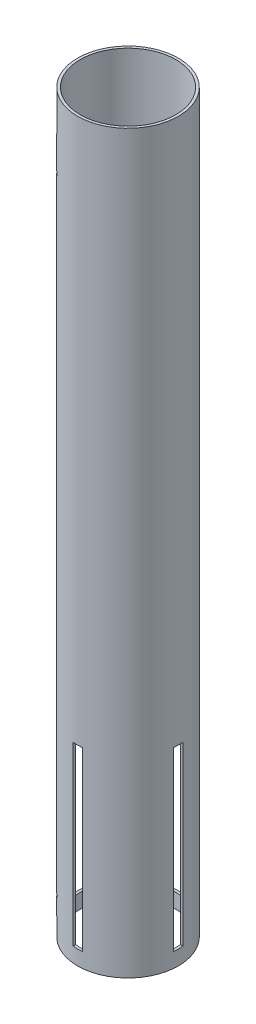
ISO-10303-21;
HEADER;
FILE_DESCRIPTION(('STEP AP214'),'2;1');
FILE_NAME('part.step','',(''),(''),'','','');
FILE_SCHEMA(('AUTOMOTIVE_DESIGN { 1 0 10303 214 1 1 1 1 }'));
ENDSEC;
DATA;
#1=APPLICATION_CONTEXT('core data for automotive mechanical design processes');
#2=APPLICATION_PROTOCOL_DEFINITION('international standard','automotive_design',2000,#1);
#3=PRODUCT_CONTEXT('',#1,'mechanical');
#4=PRODUCT('Part','Part','',(#3));
#5=PRODUCT_RELATED_PRODUCT_CATEGORY('part','',(#4));
#6=PRODUCT_DEFINITION_FORMATION('','',#4);
#7=PRODUCT_DEFINITION_CONTEXT('part definition',#1,'design');
#8=PRODUCT_DEFINITION('design','',#6,#7);
#9=PRODUCT_DEFINITION_SHAPE('','',#8);
#10=(LENGTH_UNIT() NAMED_UNIT(*) SI_UNIT(.MILLI.,.METRE.));
#11=(NAMED_UNIT(*) PLANE_ANGLE_UNIT() SI_UNIT($,.RADIAN.));
#12=(NAMED_UNIT(*) SI_UNIT($,.STERADIAN.) SOLID_ANGLE_UNIT());
#13=UNCERTAINTY_MEASURE_WITH_UNIT(LENGTH_MEASURE(1.E-05),#10,'distance_accuracy_value','');
#14=(GEOMETRIC_REPRESENTATION_CONTEXT(3) GLOBAL_UNCERTAINTY_ASSIGNED_CONTEXT((#13)) GLOBAL_UNIT_ASSIGNED_CONTEXT((#10,
#11,#12)) REPRESENTATION_CONTEXT('',''));
#15=CARTESIAN_POINT('',(0.,0.,0.));
#16=DIRECTION('',(0.,0.,1.));
#17=DIRECTION('',(1.,0.,0.));
#18=AXIS2_PLACEMENT_3D('',#15,#16,#17);
#19=CARTESIAN_POINT('',(0.,500.,0.));
#20=DIRECTION('',(0.,-1.,0.));
#21=DIRECTION('',(0.,0.,-1.));
#22=AXIS2_PLACEMENT_3D('',#19,#20,#21);
#23=CYLINDRICAL_SURFACE('',#22,34.25);
#24=DIRECTION('',(0.,-1.,0.));
#25=VECTOR('',#24,1.);
#26=CARTESIAN_POINT('',(-34.0954542424646,500.,3.25000000000018));
#27=LINE('',#26,#25);
#28=CARTESIAN_POINT('',(-34.0954542424646,130.,3.25000000000013));
#29=VERTEX_POINT('',#28);
#30=CARTESIAN_POINT('',(-34.0954542424646,10.,3.25000000000012));
#31=VERTEX_POINT('',#30);
#32=EDGE_CURVE('E241',#29,#31,#27,.T.);
#33=ORIENTED_EDGE('',*,*,#32,.T.);
#34=CARTESIAN_POINT('',(0.,10.,0.));
#35=DIRECTION('',(0.,-1.,0.));
#36=DIRECTION('',(0.,0.,-1.));
#37=AXIS2_PLACEMENT_3D('',#34,#35,#36);
#38=CIRCLE('',#37,34.25);
#39=CARTESIAN_POINT('',(-34.0954542424647,10.,-3.24999999999988));
#40=VERTEX_POINT('',#39);
#41=EDGE_CURVE('E55',#31,#40,#38,.T.);
#42=ORIENTED_EDGE('',*,*,#41,.T.);
#43=DIRECTION('',(0.,-1.,0.));
#44=VECTOR('',#43,1.);
#45=CARTESIAN_POINT('',(-34.0954542424646,500.,-3.24999999999994));
#46=LINE('',#45,#44);
#47=CARTESIAN_POINT('',(-34.0954542424646,130.,-3.2499999999999));
#48=VERTEX_POINT('',#47);
#49=EDGE_CURVE('E173',#40,#48,#46,.F.);
#50=ORIENTED_EDGE('',*,*,#49,.T.);
#51=CARTESIAN_POINT('',(0.,130.,0.));
#52=DIRECTION('',(0.,1.,0.));
#53=DIRECTION('',(0.,0.,1.));
#54=AXIS2_PLACEMENT_3D('',#51,#52,#53);
#55=CIRCLE('',#54,34.25);
#56=EDGE_CURVE('E235',#48,#29,#55,.T.);
#57=ORIENTED_EDGE('',*,*,#56,.T.);
#58=EDGE_LOOP('',(#33,#42,#50,#57));
#59=FACE_BOUND('',#58,.T.);
#60=DIRECTION('',(0.,-1.,0.));
#61=VECTOR('',#60,1.);
#62=CARTESIAN_POINT('',(34.0954542424646,500.,-3.25000000000018));
#63=LINE('',#62,#61);
#64=CARTESIAN_POINT('',(34.0954542424646,130.,-3.25000000000013));
#65=VERTEX_POINT('',#64);
#66=CARTESIAN_POINT('',(34.0954542424646,10.,-3.25000000000012));
#67=VERTEX_POINT('',#66);
#68=EDGE_CURVE('E221',#65,#67,#63,.T.);
#69=ORIENTED_EDGE('',*,*,#68,.T.);
#70=CARTESIAN_POINT('',(34.0954542424647,10.,3.24999999999988));
#71=VERTEX_POINT('',#70);
#72=EDGE_CURVE('E63',#67,#71,#38,.T.);
#73=ORIENTED_EDGE('',*,*,#72,.T.);
#74=DIRECTION('',(0.,-1.,0.));
#75=VECTOR('',#74,1.);
#76=CARTESIAN_POINT('',(34.0954542424646,500.,3.24999999999994));
#77=LINE('',#76,#75);
#78=CARTESIAN_POINT('',(34.0954542424647,130.,3.2499999999999));
#79=VERTEX_POINT('',#78);
#80=EDGE_CURVE('E211',#71,#79,#77,.F.);
#81=ORIENTED_EDGE('',*,*,#80,.T.);
#82=EDGE_CURVE('E236',#79,#65,#55,.T.);
#83=ORIENTED_EDGE('',*,*,#82,.T.);
#84=EDGE_LOOP('',(#69,#73,#81,#83));
#85=FACE_BOUND('',#84,.T.);
#86=DIRECTION('',(0.,-1.,0.));
#87=VECTOR('',#86,1.);
#88=CARTESIAN_POINT('',(3.25000000000006,500.,-34.0954542424646));
#89=LINE('',#88,#87);
#90=CARTESIAN_POINT('',(3.25,10.,-34.0954542424646));
#91=VERTEX_POINT('',#90);
#92=CARTESIAN_POINT('',(3.25000000000002,130.,-34.0954542424646));
#93=VERTEX_POINT('',#92);
#94=EDGE_CURVE('E268',#91,#93,#89,.F.);
#95=ORIENTED_EDGE('',*,*,#94,.T.);
#96=CARTESIAN_POINT('',(0.,130.,0.));
#97=DIRECTION('',(0.,1.,0.));
#98=DIRECTION('',(0.,0.,1.));
#99=AXIS2_PLACEMENT_3D('',#96,#97,#98);
#100=CIRCLE('',#99,34.25);
#101=CARTESIAN_POINT('',(-3.25000000000002,130.,-34.0954542424646));
#102=VERTEX_POINT('',#101);
#103=EDGE_CURVE('E279',#93,#102,#100,.T.);
#104=ORIENTED_EDGE('',*,*,#103,.T.);
#105=DIRECTION('',(0.,-1.,0.));
#106=VECTOR('',#105,1.);
#107=CARTESIAN_POINT('',(-3.25000000000006,500.,-34.0954542424646));
#108=LINE('',#107,#106);
#109=CARTESIAN_POINT('',(-3.25,10.,-34.0954542424646));
#110=VERTEX_POINT('',#109);
#111=EDGE_CURVE('E284',#102,#110,#108,.T.);
#112=ORIENTED_EDGE('',*,*,#111,.T.);
#113=CARTESIAN_POINT('',(0.,10.,0.));
#114=DIRECTION('',(0.,-1.,0.));
#115=DIRECTION('',(0.,0.,-1.));
#116=AXIS2_PLACEMENT_3D('',#113,#114,#115);
#117=CIRCLE('',#116,34.25);
#118=EDGE_CURVE('E264',#110,#91,#117,.T.);
#119=ORIENTED_EDGE('',*,*,#118,.T.);
#120=EDGE_LOOP('',(#95,#104,#112,#119));
#121=FACE_BOUND('',#120,.T.);
#122=CARTESIAN_POINT('',(-3.25000000000002,130.,34.0954542424646));
#123=VERTEX_POINT('',#122);
#124=CARTESIAN_POINT('',(3.25000000000002,130.,34.0954542424646));
#125=VERTEX_POINT('',#124);
#126=EDGE_CURVE('E276',#123,#125,#100,.T.);
#127=ORIENTED_EDGE('',*,*,#126,.T.);
#128=DIRECTION('',(0.,-1.,0.));
#129=VECTOR('',#128,1.);
#130=CARTESIAN_POINT('',(3.25000000000006,500.,34.0954542424646));
#131=LINE('',#130,#129);
#132=CARTESIAN_POINT('',(3.25,10.,34.0954542424646));
#133=VERTEX_POINT('',#132);
#134=EDGE_CURVE('E272',#125,#133,#131,.T.);
#135=ORIENTED_EDGE('',*,*,#134,.T.);
#136=CARTESIAN_POINT('',(-3.25,10.,34.0954542424646));
#137=VERTEX_POINT('',#136);
#138=EDGE_CURVE('E267',#133,#137,#117,.T.);
#139=ORIENTED_EDGE('',*,*,#138,.T.);
#140=DIRECTION('',(0.,-1.,0.));
#141=VECTOR('',#140,1.);
#142=CARTESIAN_POINT('',(-3.25000000000006,500.,34.0954542424646));
#143=LINE('',#142,#141);
#144=EDGE_CURVE('E280',#137,#123,#143,.F.);
#145=ORIENTED_EDGE('',*,*,#144,.T.);
#146=EDGE_LOOP('',(#127,#135,#139,#145));
#147=FACE_BOUND('',#146,.T.);
#148=CARTESIAN_POINT('',(0.,500.,0.));
#149=DIRECTION('',(0.,1.,0.));
#150=DIRECTION('',(0.,0.,1.));
#151=AXIS2_PLACEMENT_3D('',#148,#149,#150);
#152=CIRCLE('',#151,34.25);
#153=CARTESIAN_POINT('',(0.,500.,34.25));
#154=VERTEX_POINT('',#153);
#155=EDGE_CURVE('E336',#154,#154,#152,.T.);
#156=ORIENTED_EDGE('',*,*,#155,.F.);
#157=EDGE_LOOP('',(#156));
#158=FACE_BOUND('',#157,.T.);
#159=CARTESIAN_POINT('',(0.,0.,0.));
#160=DIRECTION('',(0.,1.,0.));
#161=DIRECTION('',(0.,0.,1.));
#162=AXIS2_PLACEMENT_3D('',#159,#160,#161);
#163=CIRCLE('',#162,34.25);
#164=CARTESIAN_POINT('',(0.,0.,34.25));
#165=VERTEX_POINT('',#164);
#166=EDGE_CURVE('E324',#165,#165,#163,.T.);
#167=ORIENTED_EDGE('',*,*,#166,.T.);
#168=EDGE_LOOP('',(#167));
#169=FACE_BOUND('',#168,.T.);
#170=CARTESIAN_POINT('',(-25.4242101119721,450.,22.9493363778192));
#171=CARTESIAN_POINT('',(-25.4242074720031,449.901770592295,22.9493398674085));
#172=CARTESIAN_POINT('',(-25.4186447011909,449.803471592289,22.95550662733));
#173=CARTESIAN_POINT('',(-25.3965077988186,449.609585522846,22.979994637686));
#174=CARTESIAN_POINT('',(-25.3799207054886,449.514001783964,22.9983301954627));
#175=CARTESIAN_POINT('',(-25.3361372494926,449.328382915521,23.0465551395338));
#176=CARTESIAN_POINT('',(-25.3089463102187,449.238344976749,23.0764386195126));
#177=CARTESIAN_POINT('',(-25.2446219606437,449.066345844133,23.146788605441));
#178=CARTESIAN_POINT('',(-25.2074908916692,448.984382754528,23.1872526191694));
#179=CARTESIAN_POINT('',(-25.1241564904193,448.830749476915,23.2775219072133));
#180=CARTESIAN_POINT('',(-25.0779448388649,448.759088832649,23.3273357455875));
#181=CARTESIAN_POINT('',(-24.9776250013588,448.628176023039,23.4347207530182));
#182=CARTESIAN_POINT('',(-24.9235164926849,448.568924365054,23.4922922391003));
#183=CARTESIAN_POINT('',(-24.808758359453,448.464484991776,23.6134487912893));
#184=CARTESIAN_POINT('',(-24.7481052873963,448.419304738097,23.6770370246638));
#185=CARTESIAN_POINT('',(-24.6218780656571,448.344338556817,23.8082737958549));
#186=CARTESIAN_POINT('',(-24.5563039544346,448.314552508919,23.8759223019381));
#187=CARTESIAN_POINT('',(-24.4220700674779,448.271245542788,24.0132088050842));
#188=CARTESIAN_POINT('',(-24.3534130636628,448.257710305167,24.0828449952179));
#189=CARTESIAN_POINT('',(-24.2148706627051,448.247244982029,24.2221424892551));
#190=CARTESIAN_POINT('',(-24.1449852755631,448.250314761388,24.2918037929496));
#191=CARTESIAN_POINT('',(-24.0060483123091,448.272960454871,24.4291153734872));
#192=CARTESIAN_POINT('',(-23.936996018693,448.292520956872,24.49676746703));
#193=CARTESIAN_POINT('',(-23.8016755670212,448.347568951761,24.6282692783255));
#194=CARTESIAN_POINT('',(-23.7354074210196,448.383056513597,24.6921189796162));
#195=CARTESIAN_POINT('',(-23.6076022269379,448.468968829396,24.8143395635252));
#196=CARTESIAN_POINT('',(-23.5460674192006,448.519400602493,24.8727078545816));
#197=CARTESIAN_POINT('',(-23.4296354012286,448.633764642718,24.9824156988872));
#198=CARTESIAN_POINT('',(-23.3747382400639,448.697697009644,25.0337552001752));
#199=CARTESIAN_POINT('',(-23.2732236992267,448.837334554226,25.1281591068301));
#200=CARTESIAN_POINT('',(-23.2266158544431,448.913053103821,25.1712139873108));
#201=CARTESIAN_POINT('',(-23.1432282823726,449.074066675676,25.2479049531967));
#202=CARTESIAN_POINT('',(-23.1064485577847,449.159361700565,25.2815410360151));
#203=CARTESIAN_POINT('',(-23.0438948799969,449.337115177963,25.3385715732575));
#204=CARTESIAN_POINT('',(-23.0181213015395,449.429573874257,25.3619656789582));
#205=CARTESIAN_POINT('',(-22.9784188047924,449.619026437138,25.397942696262));
#206=CARTESIAN_POINT('',(-22.9644897934747,449.716020268099,25.4105256927761));
#207=CARTESIAN_POINT('',(-22.9489411602323,449.911672386448,25.4245690553787));
#208=CARTESIAN_POINT('',(-22.9473076396927,450.010328668107,25.4260419801084));
#209=CARTESIAN_POINT('',(-22.9563668593245,450.206608406395,25.4178629397913));
#210=CARTESIAN_POINT('',(-22.9670595568969,450.304231866592,25.4082110131917));
#211=CARTESIAN_POINT('',(-23.0004122217772,450.495622210852,25.3780227345735));
#212=CARTESIAN_POINT('',(-23.0230658441435,450.589391111254,25.3574921533615));
#213=CARTESIAN_POINT('',(-23.0796014210268,450.770472703062,25.3060457318804));
#214=CARTESIAN_POINT('',(-23.1134834434358,450.857785355426,25.275129828817));
#215=CARTESIAN_POINT('',(-23.1914245502501,451.023562023121,25.2036329896147));
#216=CARTESIAN_POINT('',(-23.2354927476495,451.102018020797,25.1630433979576));
#217=CARTESIAN_POINT('',(-23.3323948278473,451.247773641488,25.0732168804854));
#218=CARTESIAN_POINT('',(-23.3852287690253,451.315073190195,25.0239798970788));
#219=CARTESIAN_POINT('',(-23.4980697098282,451.436668417507,24.9180497345521));
#220=CARTESIAN_POINT('',(-23.5580832992536,451.490952010084,24.8613497006548));
#221=CARTESIAN_POINT('',(-23.6834044226853,451.584891782499,24.7419953258782));
#222=CARTESIAN_POINT('',(-23.7487119328871,451.624548028105,24.6793410117725));
#223=CARTESIAN_POINT('',(-23.8826228137493,451.68808628699,24.5497758832419));
#224=CARTESIAN_POINT('',(-23.9512245525817,451.71197602563,24.482867171057));
#225=CARTESIAN_POINT('',(-24.0897322314532,451.743328426567,24.3465959764622));
#226=CARTESIAN_POINT('',(-24.1596381637009,451.750791186971,24.2772335087092));
#227=CARTESIAN_POINT('',(-24.2986621573305,451.749076856617,24.1380856579378));
#228=CARTESIAN_POINT('',(-24.3677810258405,451.739918720431,24.068300847006));
#229=CARTESIAN_POINT('',(-24.5033775861269,451.705261754435,23.9302392966729));
#230=CARTESIAN_POINT('',(-24.5698552729506,451.679762893983,23.8619625600998));
#231=CARTESIAN_POINT('',(-24.6983608046582,451.613152214337,23.7289282125066));
#232=CARTESIAN_POINT('',(-24.7603886209738,451.572040294918,23.6641706240802));
#233=CARTESIAN_POINT('',(-24.8783528122861,451.475373731989,23.5401231311118));
#234=CARTESIAN_POINT('',(-24.9342893719086,451.419819526398,23.4808330608579));
#235=CARTESIAN_POINT('',(-25.0386892079771,451.295777272689,23.3694754961158));
#236=CARTESIAN_POINT('',(-25.0871447257626,451.227275958551,23.3174155055581));
#237=CARTESIAN_POINT('',(-25.1753053218222,451.0792937104,23.2222032640577));
#238=CARTESIAN_POINT('',(-25.2150082451399,450.999810080275,23.1790532069746));
#239=CARTESIAN_POINT('',(-25.2847012268721,450.832054701006,23.1030096604314));
#240=CARTESIAN_POINT('',(-25.3146817118499,450.743774401119,23.070126281486));
#241=CARTESIAN_POINT('',(-25.3641180030575,450.56105904951,23.0157637446964));
#242=CARTESIAN_POINT('',(-25.3835862328827,450.466631411451,22.9942711255803));
#243=CARTESIAN_POINT('',(-25.4064303868154,450.309681486703,22.9690216733745));
#244=CARTESIAN_POINT('',(-25.4130903835685,450.248175641119,22.9616502425024));
#245=CARTESIAN_POINT('',(-25.4219810805515,450.124455843637,22.951806491355));
#246=CARTESIAN_POINT('',(-25.424211784757,450.062241892375,22.9493341666826));
#247=CARTESIAN_POINT('',(-25.4242101119721,450.,22.9493363778192));
#248=B_SPLINE_CURVE_WITH_KNOTS('',3,(#170,#171,#172,#173,#174,#175,#176,#177,#178,#179,#180,
#181,#182,#183,#184,#185,#186,#187,#188,#189,#190,#191,#192,#193,#194,#195,#196,#197,#198,#199,
#200,#201,#202,#203,#204,#205,#206,#207,#208,#209,#210,#211,#212,#213,#214,#215,#216,#217,#218,
#219,#220,#221,#222,#223,#224,#225,#226,#227,#228,#229,#230,#231,#232,#233,#234,#235,#236,#237,
#238,#239,#240,#241,#242,#243,#244,#245,#246,#247),.UNSPECIFIED.,.T.,.F.,(4,2,2,2,2,2,2,2,2,2,2,
2,2,2,2,2,2,2,2,2,2,2,2,2,2,2,2,2,2,2,2,2,2,2,2,2,2,2,4),(0.,0.294461015066377,
0.589268854510455,0.883926110289581,1.17851402263195,1.47337309406503,1.76824421892907,
2.06327143932557,2.35829635420058,2.65306111686975,2.94782348088418,3.24231066692114,
3.53679912782261,3.83142612658484,4.12605530329604,4.42102121936323,4.71598721643981,
5.01096325586225,5.3059369785023,5.60057721768591,5.89521643860615,6.18969951832426,
6.48418437865139,6.77893372466738,7.07368503378298,7.3687089848368,7.66373160936348,
7.95860956953155,8.25348576861378,8.54802590034286,8.84256658437637,9.13710915920042,
9.43164280396257,9.72647988962664,10.0213894855872,10.3165885959275,10.6114380661512,
10.7980199430767,10.9846016525336),.UNSPECIFIED.);
#249=CARTESIAN_POINT('',(-25.4242101119721,450.,22.9493363778192));
#250=VERTEX_POINT('',#249);
#251=EDGE_CURVE('E289',#250,#250,#248,.T.);
#252=ORIENTED_EDGE('',*,*,#251,.F.);
#253=EDGE_LOOP('',(#252));
#254=FACE_BOUND('',#253,.T.);
#255=CARTESIAN_POINT('',(-25.4242101119721,25.,22.9493363778192));
#256=CARTESIAN_POINT('',(-25.4242074720031,24.901770592295,22.9493398674085));
#257=CARTESIAN_POINT('',(-25.4186447011909,24.8034715922895,22.95550662733));
#258=CARTESIAN_POINT('',(-25.3965077988186,24.6095855228461,22.979994637686));
#259=CARTESIAN_POINT('',(-25.3799207054886,24.5140017839636,22.9983301954627));
#260=CARTESIAN_POINT('',(-25.3361372494927,24.3283829155214,23.0465551395338));
#261=CARTESIAN_POINT('',(-25.3089463102187,24.2383449767487,23.0764386195126));
#262=CARTESIAN_POINT('',(-25.2446219606437,24.0663458441326,23.146788605441));
#263=CARTESIAN_POINT('',(-25.2074908916692,23.9843827545276,23.1872526191693));
#264=CARTESIAN_POINT('',(-25.1241564904193,23.8307494769145,23.2775219072133));
#265=CARTESIAN_POINT('',(-25.0779448388649,23.7590888326494,23.3273357455875));
#266=CARTESIAN_POINT('',(-24.9776250013588,23.6281760230386,23.4347207530182));
#267=CARTESIAN_POINT('',(-24.9235164926849,23.5689243650543,23.4922922391003));
#268=CARTESIAN_POINT('',(-24.808758359453,23.464484991776,23.6134487912893));
#269=CARTESIAN_POINT('',(-24.7481052873963,23.4193047380967,23.6770370246637));
#270=CARTESIAN_POINT('',(-24.6218780656571,23.344338556817,23.8082737958549));
#271=CARTESIAN_POINT('',(-24.5563039544346,23.3145525089187,23.8759223019381));
#272=CARTESIAN_POINT('',(-24.4220700674779,23.2712455427878,24.0132088050842));
#273=CARTESIAN_POINT('',(-24.3534130636628,23.2577103051665,24.0828449952179));
#274=CARTESIAN_POINT('',(-24.2148706627051,23.2472449820288,24.2221424892551));
#275=CARTESIAN_POINT('',(-24.144985275563,23.2503147613884,24.2918037929496));
#276=CARTESIAN_POINT('',(-24.0060483123091,23.272960454871,24.4291153734872));
#277=CARTESIAN_POINT('',(-23.936996018693,23.2925209568725,24.49676746703));
#278=CARTESIAN_POINT('',(-23.8016755670212,23.3475689517609,24.6282692783256));
#279=CARTESIAN_POINT('',(-23.7354074210195,23.3830565135971,24.6921189796162));
#280=CARTESIAN_POINT('',(-23.6076022269379,23.4689688293963,24.8143395635252));
#281=CARTESIAN_POINT('',(-23.5460674192006,23.5194006024927,24.8727078545816));
#282=CARTESIAN_POINT('',(-23.4296354012286,23.6337646427185,24.9824156988872));
#283=CARTESIAN_POINT('',(-23.3747382400639,23.6976970096439,25.0337552001752));
#284=CARTESIAN_POINT('',(-23.2732236992267,23.837334554226,25.1281591068302));
#285=CARTESIAN_POINT('',(-23.2266158544431,23.9130531038211,25.1712139873108));
#286=CARTESIAN_POINT('',(-23.1432282823725,24.0740666756757,25.2479049531967));
#287=CARTESIAN_POINT('',(-23.1064485577847,24.1593617005654,25.2815410360151));
#288=CARTESIAN_POINT('',(-23.0438948799969,24.3371151779634,25.3385715732575));
#289=CARTESIAN_POINT('',(-23.0181213015395,24.4295738742574,25.3619656789582));
#290=CARTESIAN_POINT('',(-22.9784188047924,24.6190264371381,25.397942696262));
#291=CARTESIAN_POINT('',(-22.9644897934747,24.7160202680992,25.4105256927761));
#292=CARTESIAN_POINT('',(-22.9489411602323,24.9116723864484,25.4245690553787));
#293=CARTESIAN_POINT('',(-22.9473076396927,25.0103286681074,25.4260419801084));
#294=CARTESIAN_POINT('',(-22.9563668593245,25.2066084063951,25.4178629397913));
#295=CARTESIAN_POINT('',(-22.9670595568969,25.3042318665919,25.4082110131917));
#296=CARTESIAN_POINT('',(-23.0004122217772,25.495622210852,25.3780227345735));
#297=CARTESIAN_POINT('',(-23.0230658441435,25.5893911112543,25.3574921533615));
#298=CARTESIAN_POINT('',(-23.0796014210268,25.7704727030618,25.3060457318803));
#299=CARTESIAN_POINT('',(-23.1134834434359,25.8577853554257,25.2751298288169));
#300=CARTESIAN_POINT('',(-23.1914245502501,26.0235620231213,25.2036329896147));
#301=CARTESIAN_POINT('',(-23.2354927476495,26.102018020797,25.1630433979575));
#302=CARTESIAN_POINT('',(-23.3323948278473,26.2477736414876,25.0732168804854));
#303=CARTESIAN_POINT('',(-23.3852287690253,26.315073190195,25.0239798970788));
#304=CARTESIAN_POINT('',(-23.4980697098282,26.4366684175074,24.9180497345521));
#305=CARTESIAN_POINT('',(-23.5580832992536,26.4909520100841,24.8613497006548));
#306=CARTESIAN_POINT('',(-23.6834044226853,26.5848917824985,24.7419953258782));
#307=CARTESIAN_POINT('',(-23.7487119328871,26.624548028105,24.6793410117725));
#308=CARTESIAN_POINT('',(-23.8826228137493,26.6880862869905,24.5497758832419));
#309=CARTESIAN_POINT('',(-23.9512245525818,26.7119760256299,24.482867171057));
#310=CARTESIAN_POINT('',(-24.0897322314533,26.7433284265674,24.3465959764622));
#311=CARTESIAN_POINT('',(-24.1596381637009,26.7507911869712,24.2772335087092));
#312=CARTESIAN_POINT('',(-24.2986621573305,26.7490768566168,24.1380856579378));
#313=CARTESIAN_POINT('',(-24.3677810258405,26.7399187204314,24.0683008470059));
#314=CARTESIAN_POINT('',(-24.5033775861269,26.705261754435,23.9302392966729));
#315=CARTESIAN_POINT('',(-24.5698552729506,26.6797628939829,23.8619625600998));
#316=CARTESIAN_POINT('',(-24.6983608046582,26.613152214337,23.7289282125066));
#317=CARTESIAN_POINT('',(-24.7603886209738,26.5720402949176,23.6641706240802));
#318=CARTESIAN_POINT('',(-24.8783528122861,26.4753737319888,23.5401231311118));
#319=CARTESIAN_POINT('',(-24.9342893719086,26.4198195263976,23.4808330608579));
#320=CARTESIAN_POINT('',(-25.0386892079771,26.2957772726892,23.3694754961158));
#321=CARTESIAN_POINT('',(-25.0871447257626,26.2272759585506,23.3174155055581));
#322=CARTESIAN_POINT('',(-25.1753053218222,26.0792937103997,23.2222032640577));
#323=CARTESIAN_POINT('',(-25.2150082451399,25.999810080275,23.1790532069746));
#324=CARTESIAN_POINT('',(-25.2847012268721,25.8320547010063,23.1030096604314));
#325=CARTESIAN_POINT('',(-25.3146817118499,25.7437744011193,23.070126281486));
#326=CARTESIAN_POINT('',(-25.3641180030575,25.5610590495097,23.0157637446964));
#327=CARTESIAN_POINT('',(-25.3835862328827,25.4666314114506,22.9942711255803));
#328=CARTESIAN_POINT('',(-25.4064303868154,25.3096814867034,22.9690216733745));
#329=CARTESIAN_POINT('',(-25.4130903835685,25.2481756411186,22.9616502425024));
#330=CARTESIAN_POINT('',(-25.4219810805515,25.1244558436368,22.951806491355));
#331=CARTESIAN_POINT('',(-25.424211784757,25.0622418923755,22.9493341666826));
#332=CARTESIAN_POINT('',(-25.4242101119721,25.,22.9493363778192));
#333=B_SPLINE_CURVE_WITH_KNOTS('',3,(#255,#256,#257,#258,#259,#260,#261,#262,#263,#264,#265,
#266,#267,#268,#269,#270,#271,#272,#273,#274,#275,#276,#277,#278,#279,#280,#281,#282,#283,#284,
#285,#286,#287,#288,#289,#290,#291,#292,#293,#294,#295,#296,#297,#298,#299,#300,#301,#302,#303,
#304,#305,#306,#307,#308,#309,#310,#311,#312,#313,#314,#315,#316,#317,#318,#319,#320,#321,#322,
#323,#324,#325,#326,#327,#328,#329,#330,#331,#332),.UNSPECIFIED.,.T.,.F.,(4,2,2,2,2,2,2,2,2,2,2,
2,2,2,2,2,2,2,2,2,2,2,2,2,2,2,2,2,2,2,2,2,2,2,2,2,2,2,4),(0.,0.294461015066373,
0.589268854510459,0.883926110289566,1.17851402263194,1.47337309406503,1.76824421892908,
2.06327143932559,2.35829635420058,2.65306111686976,2.94782348088421,3.24231066692119,
3.53679912782265,3.83142612658492,4.12605530329604,4.42102121936332,4.71598721643986,
5.01096325586228,5.30593697850235,5.600577217686,5.89521643860615,6.18969951832441,
6.48418437865148,6.7789337246674,7.07368503378298,7.3687089848368,7.6637316093635,
7.95860956953157,8.2534857686138,8.54802590034289,8.8425665843764,9.13710915920043,
9.43164280396258,9.72647988962668,10.0213894855872,10.3165885959276,10.6114380661512,
10.7980199430767,10.9846016525336),.UNSPECIFIED.);
#334=CARTESIAN_POINT('',(-25.4242101119721,25.,22.9493363778192));
#335=VERTEX_POINT('',#334);
#336=EDGE_CURVE('E298',#335,#335,#333,.T.);
#337=ORIENTED_EDGE('',*,*,#336,.F.);
#338=EDGE_LOOP('',(#337));
#339=FACE_BOUND('',#338,.T.);
#340=ADVANCED_FACE('F39',(#59,#85,#121,#147,#158,#169,#254,#339),#23,.T.);
#341=CARTESIAN_POINT('',(0.,500.,0.));
#342=DIRECTION('',(0.,-1.,0.));
#343=DIRECTION('',(0.,0.,-1.));
#344=AXIS2_PLACEMENT_3D('',#341,#342,#343);
#345=CYLINDRICAL_SURFACE('',#344,32.5);
#346=DIRECTION('',(0.,-1.,0.));
#347=VECTOR('',#346,1.);
#348=CARTESIAN_POINT('',(32.3370917059652,500.,3.24999999999995));
#349=LINE('',#348,#347);
#350=CARTESIAN_POINT('',(32.3370917059652,10.,3.24999999999989));
#351=VERTEX_POINT('',#350);
#352=CARTESIAN_POINT('',(32.3370917059652,130.,3.2499999999999));
#353=VERTEX_POINT('',#352);
#354=EDGE_CURVE('E11',#351,#353,#349,.F.);
#355=ORIENTED_EDGE('',*,*,#354,.F.);
#356=CARTESIAN_POINT('',(0.,10.,0.));
#357=DIRECTION('',(0.,-1.,0.));
#358=DIRECTION('',(0.,0.,-1.));
#359=AXIS2_PLACEMENT_3D('',#356,#357,#358);
#360=CIRCLE('',#359,32.5);
#361=CARTESIAN_POINT('',(32.3370917059651,10.,-3.25000000000011));
#362=VERTEX_POINT('',#361);
#363=EDGE_CURVE('E168',#362,#351,#360,.T.);
#364=ORIENTED_EDGE('',*,*,#363,.F.);
#365=DIRECTION('',(0.,-1.,0.));
#366=VECTOR('',#365,1.);
#367=CARTESIAN_POINT('',(32.3370917059651,500.,-3.25000000000017));
#368=LINE('',#367,#366);
#369=CARTESIAN_POINT('',(32.3370917059651,130.,-3.25000000000013));
#370=VERTEX_POINT('',#369);
#371=EDGE_CURVE('E190',#370,#362,#368,.T.);
#372=ORIENTED_EDGE('',*,*,#371,.F.);
#373=CARTESIAN_POINT('',(0.,130.,0.));
#374=DIRECTION('',(0.,1.,0.));
#375=DIRECTION('',(0.,0.,1.));
#376=AXIS2_PLACEMENT_3D('',#373,#374,#375);
#377=CIRCLE('',#376,32.5);
#378=EDGE_CURVE('E48',#353,#370,#377,.T.);
#379=ORIENTED_EDGE('',*,*,#378,.F.);
#380=EDGE_LOOP('',(#355,#364,#372,#379));
#381=FACE_BOUND('',#380,.T.);
#382=DIRECTION('',(0.,-1.,0.));
#383=VECTOR('',#382,1.);
#384=CARTESIAN_POINT('',(-32.3370917059651,500.,3.25000000000017));
#385=LINE('',#384,#383);
#386=CARTESIAN_POINT('',(-32.3370917059651,130.,3.25000000000013));
#387=VERTEX_POINT('',#386);
#388=CARTESIAN_POINT('',(-32.3370917059651,10.,3.25000000000011));
#389=VERTEX_POINT('',#388);
#390=EDGE_CURVE('E185',#387,#389,#385,.T.);
#391=ORIENTED_EDGE('',*,*,#390,.F.);
#392=CARTESIAN_POINT('',(-32.3370917059652,130.,-3.2499999999999));
#393=VERTEX_POINT('',#392);
#394=EDGE_CURVE('E181',#393,#387,#377,.T.);
#395=ORIENTED_EDGE('',*,*,#394,.F.);
#396=DIRECTION('',(0.,-1.,0.));
#397=VECTOR('',#396,1.);
#398=CARTESIAN_POINT('',(-32.3370917059652,500.,-3.24999999999995));
#399=LINE('',#398,#397);
#400=CARTESIAN_POINT('',(-32.3370917059652,10.,-3.24999999999989));
#401=VERTEX_POINT('',#400);
#402=EDGE_CURVE('E165',#401,#393,#399,.F.);
#403=ORIENTED_EDGE('',*,*,#402,.F.);
#404=EDGE_CURVE('E153',#389,#401,#360,.T.);
#405=ORIENTED_EDGE('',*,*,#404,.F.);
#406=EDGE_LOOP('',(#391,#395,#403,#405));
#407=FACE_BOUND('',#406,.T.);
#408=DIRECTION('',(0.,-1.,0.));
#409=VECTOR('',#408,1.);
#410=CARTESIAN_POINT('',(-3.25000000000006,500.,32.3370917059651));
#411=LINE('',#410,#409);
#412=CARTESIAN_POINT('',(-3.25,10.,32.3370917059652));
#413=VERTEX_POINT('',#412);
#414=CARTESIAN_POINT('',(-3.25000000000002,130.,32.3370917059651));
#415=VERTEX_POINT('',#414);
#416=EDGE_CURVE('E166',#413,#415,#411,.F.);
#417=ORIENTED_EDGE('',*,*,#416,.F.);
#418=CARTESIAN_POINT('',(0.,10.,0.));
#419=DIRECTION('',(0.,-1.,0.));
#420=DIRECTION('',(0.,0.,-1.));
#421=AXIS2_PLACEMENT_3D('',#418,#419,#420);
#422=CIRCLE('',#421,32.5);
#423=CARTESIAN_POINT('',(3.25,10.,32.3370917059652));
#424=VERTEX_POINT('',#423);
#425=EDGE_CURVE('E337',#424,#413,#422,.T.);
#426=ORIENTED_EDGE('',*,*,#425,.F.);
#427=DIRECTION('',(0.,-1.,0.));
#428=VECTOR('',#427,1.);
#429=CARTESIAN_POINT('',(3.25000000000006,500.,32.3370917059651));
#430=LINE('',#429,#428);
#431=CARTESIAN_POINT('',(3.25000000000002,130.,32.3370917059651));
#432=VERTEX_POINT('',#431);
#433=EDGE_CURVE('E348',#432,#424,#430,.T.);
#434=ORIENTED_EDGE('',*,*,#433,.F.);
#435=CARTESIAN_POINT('',(0.,130.,0.));
#436=DIRECTION('',(0.,1.,0.));
#437=DIRECTION('',(0.,0.,1.));
#438=AXIS2_PLACEMENT_3D('',#435,#436,#437);
#439=CIRCLE('',#438,32.5);
#440=EDGE_CURVE('E344',#415,#432,#439,.T.);
#441=ORIENTED_EDGE('',*,*,#440,.F.);
#442=EDGE_LOOP('',(#417,#426,#434,#441));
#443=FACE_BOUND('',#442,.T.);
#444=DIRECTION('',(0.,-1.,0.));
#445=VECTOR('',#444,1.);
#446=CARTESIAN_POINT('',(-3.25000000000006,500.,-32.3370917059651));
#447=LINE('',#446,#445);
#448=CARTESIAN_POINT('',(-3.25000000000002,130.,-32.3370917059651));
#449=VERTEX_POINT('',#448);
#450=CARTESIAN_POINT('',(-3.25,10.,-32.3370917059652));
#451=VERTEX_POINT('',#450);
#452=EDGE_CURVE('E343',#449,#451,#447,.T.);
#453=ORIENTED_EDGE('',*,*,#452,.F.);
#454=CARTESIAN_POINT('',(3.25000000000002,130.,-32.3370917059651));
#455=VERTEX_POINT('',#454);
#456=EDGE_CURVE('E340',#455,#449,#439,.T.);
#457=ORIENTED_EDGE('',*,*,#456,.F.);
#458=DIRECTION('',(0.,-1.,0.));
#459=VECTOR('',#458,1.);
#460=CARTESIAN_POINT('',(3.25000000000006,500.,-32.3370917059651));
#461=LINE('',#460,#459);
#462=CARTESIAN_POINT('',(3.25,10.,-32.3370917059652));
#463=VERTEX_POINT('',#462);
#464=EDGE_CURVE('E335',#463,#455,#461,.F.);
#465=ORIENTED_EDGE('',*,*,#464,.F.);
#466=EDGE_CURVE('E332',#451,#463,#422,.T.);
#467=ORIENTED_EDGE('',*,*,#466,.F.);
#468=EDGE_LOOP('',(#453,#457,#465,#467));
#469=FACE_BOUND('',#468,.T.);
#470=CARTESIAN_POINT('',(-24.1850674637198,450.,21.7101937295669));
#471=CARTESIAN_POINT('',(-24.1850648483574,449.901778210705,21.7101972396167));
#472=CARTESIAN_POINT('',(-24.1795192421165,449.803487015341,21.7163793522554));
#473=CARTESIAN_POINT('',(-24.15744942212,449.609616863206,21.7409268277216));
#474=CARTESIAN_POINT('',(-24.1409123173606,449.514041228696,21.7593064959972));
#475=CARTESIAN_POINT('',(-24.0972566097229,449.328438610944,21.8076426577846));
#476=CARTESIAN_POINT('',(-24.0701434553114,449.238408798268,21.8375931902545));
#477=CARTESIAN_POINT('',(-24.0059942764623,449.066424310135,21.9080920918614));
#478=CARTESIAN_POINT('',(-23.9689605743258,448.984467750944,21.9486379806769));
#479=CARTESIAN_POINT('',(-23.8858263558122,448.830837669875,22.0390803944809));
#480=CARTESIAN_POINT('',(-23.8397167131032,448.759174625169,22.0889863290828));
#481=CARTESIAN_POINT('',(-23.7395969024449,448.628255264339,22.1965521217657));
#482=CARTESIAN_POINT('',(-23.6855864101732,448.568999457762,22.2542122981434));
#483=CARTESIAN_POINT('',(-23.5710056247181,448.464546727739,22.37553685237));
#484=CARTESIAN_POINT('',(-23.5104314790148,448.419358121917,22.4392047535752));
#485=CARTESIAN_POINT('',(-23.3843369478348,448.34437587221,22.5705796737489));
#486=CARTESIAN_POINT('',(-23.3188166041978,448.314582098115,22.6382866585499));
#487=CARTESIAN_POINT('',(-23.184665594001,448.271263354522,22.7756555118932));
#488=CARTESIAN_POINT('',(-23.1160380362848,448.257722481214,22.8453154010408));
#489=CARTESIAN_POINT('',(-22.9775213013378,448.247244824235,22.9846288231139));
#490=CARTESIAN_POINT('',(-22.9076321352608,448.250307893844,23.0542823560901));
#491=CARTESIAN_POINT('',(-22.7686626402609,448.272937999976,23.1915401102018));
#492=CARTESIAN_POINT('',(-22.6995815478602,448.292487921813,23.259146381199));
#493=CARTESIAN_POINT('',(-22.5641749152749,448.347510243193,23.3905304756369));
#494=CARTESIAN_POINT('',(-22.4978493879993,448.382982717319,23.4543082811433));
#495=CARTESIAN_POINT('',(-22.3699038943671,448.468862686135,23.5763701681882));
#496=CARTESIAN_POINT('',(-22.3082864022501,448.519277966818,23.6346513647825));
#497=CARTESIAN_POINT('',(-22.1916758251839,448.633606764838,23.7441768368717));
#498=CARTESIAN_POINT('',(-22.1366827949118,448.697520393577,23.7954210542853));
#499=CARTESIAN_POINT('',(-22.034966627996,448.837128341239,23.8896435602975));
#500=CARTESIAN_POINT('',(-21.9882540769381,448.912837510433,23.9326112743827));
#501=CARTESIAN_POINT('',(-21.904666718862,449.073835304999,24.0091398828625));
#502=CARTESIAN_POINT('',(-21.8677919147864,449.159123933238,24.0427007744433));
#503=CARTESIAN_POINT('',(-21.80506767203,449.336868782738,24.099602198212));
#504=CARTESIAN_POINT('',(-21.7792186603533,449.429325281433,24.1229423345739));
#505=CARTESIAN_POINT('',(-21.7393933344364,449.61877721357,24.1588390126501));
#506=CARTESIAN_POINT('',(-21.7254169166268,449.715772607412,24.171395648433));
#507=CARTESIAN_POINT('',(-21.7098074162512,449.911418598018,24.1854165619133));
#508=CARTESIAN_POINT('',(-21.7081588585297,450.010066963765,24.1868947463892));
#509=CARTESIAN_POINT('',(-21.7172186646575,450.206333249114,24.1787602888141));
#510=CARTESIAN_POINT('',(-21.727926980997,450.303951172678,24.1691476894051));
#511=CARTESIAN_POINT('',(-21.7613374650567,450.495327088689,24.1390698097713));
#512=CARTESIAN_POINT('',(-21.7840325601908,450.589087322171,24.1186109291754));
#513=CARTESIAN_POINT('',(-21.8406709903682,450.770155423715,24.0673334959177));
#514=CARTESIAN_POINT('',(-21.8746144010278,450.857463248396,24.0365148736128));
#515=CARTESIAN_POINT('',(-21.952693761213,451.023243725292,23.9652252951938));
#516=CARTESIAN_POINT('',(-21.9968398398448,451.101707481267,23.9247447454986));
#517=CARTESIAN_POINT('',(-22.0939015229475,451.247482998095,23.8351393214344));
#518=CARTESIAN_POINT('',(-22.1468171919308,451.314794676902,23.7860143834739));
#519=CARTESIAN_POINT('',(-22.2598215909382,451.436425227697,23.6802940045882));
#520=CARTESIAN_POINT('',(-22.3199176385312,451.490730672722,23.6236909363359));
#521=CARTESIAN_POINT('',(-22.4453897131333,451.584715409201,23.5045093021031));
#522=CARTESIAN_POINT('',(-22.5107657144224,451.624394771897,23.4419307652302));
#523=CARTESIAN_POINT('',(-22.6447880471033,451.687977548214,23.3124911058649));
#524=CARTESIAN_POINT('',(-22.7134325815426,451.711889525361,23.2456323297246));
#525=CARTESIAN_POINT('',(-22.8519981784964,451.743286795821,23.1094269373344));
#526=CARTESIAN_POINT('',(-22.9219192322845,451.750772201382,23.0400803380881));
#527=CARTESIAN_POINT('',(-23.060934714295,451.749102781483,22.9009377496935));
#528=CARTESIAN_POINT('',(-23.1300300766644,451.739969003019,22.8311424403351));
#529=CARTESIAN_POINT('',(-23.2655519341659,451.705364035564,22.6930266336498));
#530=CARTESIAN_POINT('',(-23.3319784243554,451.679892816317,22.6247061390543));
#531=CARTESIAN_POINT('',(-23.4603593959275,451.6133404546,22.4915561320225));
#532=CARTESIAN_POINT('',(-23.5223138601722,451.572259252313,22.4267266329647));
#533=CARTESIAN_POINT('',(-23.6401183094208,451.475656450699,22.3025142710907));
#534=CARTESIAN_POINT('',(-23.6959684734691,451.420135275069,22.2431312485329));
#535=CARTESIAN_POINT('',(-23.8001997629398,451.296152290166,22.1315687830442));
#536=CARTESIAN_POINT('',(-23.8485721855644,451.227675605908,22.0793977409662));
#537=CARTESIAN_POINT('',(-23.9365734929329,451.079739041329,21.9839640519327));
#538=CARTESIAN_POINT('',(-23.9762002268146,451.000276467001,21.9407035965676));
#539=CARTESIAN_POINT('',(-24.0457598961249,450.832553271365,21.8644484517052));
#540=CARTESIAN_POINT('',(-24.0756827168403,450.744283594598,21.8314644751225));
#541=CARTESIAN_POINT('',(-24.1250278437439,450.5615826538,21.7769234967333));
#542=CARTESIAN_POINT('',(-24.1444625235934,450.467158798445,21.7553530301262));
#543=CARTESIAN_POINT('',(-24.1672878934747,450.310125665479,21.7299875416334));
#544=CARTESIAN_POINT('',(-24.1739478769782,450.24853295434,21.7225755611675));
#545=CARTESIAN_POINT('',(-24.1828384897365,450.124636145479,21.7126775438612));
#546=CARTESIAN_POINT('',(-24.1850691234421,450.062332048471,21.7101915020713));
#547=CARTESIAN_POINT('',(-24.1850674637198,450.,21.7101937295669));
#548=B_SPLINE_CURVE_WITH_KNOTS('',3,(#470,#471,#472,#473,#474,#475,#476,#477,#478,#479,#480,
#481,#482,#483,#484,#485,#486,#487,#488,#489,#490,#491,#492,#493,#494,#495,#496,#497,#498,#499,
#500,#501,#502,#503,#504,#505,#506,#507,#508,#509,#510,#511,#512,#513,#514,#515,#516,#517,#518,
#519,#520,#521,#522,#523,#524,#525,#526,#527,#528,#529,#530,#531,#532,#533,#534,#535,#536,#537,
#538,#539,#540,#541,#542,#543,#544,#545,#546,#547),.UNSPECIFIED.,.T.,.F.,(4,2,2,2,2,2,2,2,2,2,2,
2,2,2,2,2,2,2,2,2,2,2,2,2,2,2,2,2,2,2,2,2,2,2,2,2,2,2,4),(0.,0.294437827732533,
0.589221587595548,0.883853683760139,1.17841686967608,1.4732777815256,1.76815080054028,
2.06319784177107,2.35824238749538,2.65299798986497,2.94775098761666,3.242198384007,
3.53664715962684,3.8312496291313,4.12585453005833,4.4208333733111,4.71581230479754,
5.01080265911713,5.305790440092,5.60040786081895,5.89502414880245,6.18946679755153,
6.4839114257189,6.77864964091688,7.07339002441894,7.36843338361869,7.66347530567549,
7.95835685334719,8.25323638597452,8.54774273484588,8.84224962910411,9.13675765192292,
9.43125703425509,9.72609662355814,10.0210086433437,10.3162270790944,10.6110964574258,
10.7979483924508,10.984800139724),.UNSPECIFIED.);
#549=CARTESIAN_POINT('',(-24.1850674637198,450.,21.7101937295669));
#550=VERTEX_POINT('',#549);
#551=EDGE_CURVE('E288',#550,#550,#548,.T.);
#552=ORIENTED_EDGE('',*,*,#551,.T.);
#553=EDGE_LOOP('',(#552));
#554=FACE_BOUND('',#553,.T.);
#555=CARTESIAN_POINT('',(0.,500.,0.));
#556=DIRECTION('',(0.,1.,0.));
#557=DIRECTION('',(0.,0.,1.));
#558=AXIS2_PLACEMENT_3D('',#555,#556,#557);
#559=CIRCLE('',#558,32.5);
#560=CARTESIAN_POINT('',(0.,500.,32.5));
#561=VERTEX_POINT('',#560);
#562=EDGE_CURVE('E374',#561,#561,#559,.T.);
#563=ORIENTED_EDGE('',*,*,#562,.T.);
#564=EDGE_LOOP('',(#563));
#565=FACE_BOUND('',#564,.T.);
#566=CARTESIAN_POINT('',(0.,0.,0.));
#567=DIRECTION('',(0.,1.,0.));
#568=DIRECTION('',(0.,0.,1.));
#569=AXIS2_PLACEMENT_3D('',#566,#567,#568);
#570=CIRCLE('',#569,32.5);
#571=CARTESIAN_POINT('',(0.,0.,32.5));
#572=VERTEX_POINT('',#571);
#573=EDGE_CURVE('E377',#572,#572,#570,.T.);
#574=ORIENTED_EDGE('',*,*,#573,.F.);
#575=EDGE_LOOP('',(#574));
#576=FACE_BOUND('',#575,.T.);
#577=CARTESIAN_POINT('',(-24.1850674637198,25.,21.7101937295669));
#578=CARTESIAN_POINT('',(-24.1850648483574,24.9017782107051,21.7101972396167));
#579=CARTESIAN_POINT('',(-24.1795192421165,24.8034870153412,21.7163793522554));
#580=CARTESIAN_POINT('',(-24.15744942212,24.6096168632064,21.7409268277216));
#581=CARTESIAN_POINT('',(-24.1409123173606,24.5140412286963,21.7593064959972));
#582=CARTESIAN_POINT('',(-24.0972566097229,24.328438610944,21.8076426577846));
#583=CARTESIAN_POINT('',(-24.0701434553114,24.2384087982679,21.8375931902545));
#584=CARTESIAN_POINT('',(-24.0059942764623,24.0664243101353,21.9080920918614));
#585=CARTESIAN_POINT('',(-23.9689605743258,23.9844677509443,21.948637980677));
#586=CARTESIAN_POINT('',(-23.8858263558122,23.8308376698748,22.039080394481));
#587=CARTESIAN_POINT('',(-23.8397167131031,23.7591746251692,22.0889863290828));
#588=CARTESIAN_POINT('',(-23.7395969024449,23.6282552643388,22.1965521217657));
#589=CARTESIAN_POINT('',(-23.6855864101732,23.5689994577625,22.2542122981434));
#590=CARTESIAN_POINT('',(-23.5710056247181,23.4645467277385,22.37553685237));
#591=CARTESIAN_POINT('',(-23.5104314790148,23.4193581219174,22.4392047535753));
#592=CARTESIAN_POINT('',(-23.3843369478348,23.3443758722095,22.5705796737489));
#593=CARTESIAN_POINT('',(-23.3188166041977,23.3145820981155,22.6382866585499));
#594=CARTESIAN_POINT('',(-23.184665594001,23.2712633545225,22.7756555118932));
#595=CARTESIAN_POINT('',(-23.1160380362848,23.257722481214,22.8453154010409));
#596=CARTESIAN_POINT('',(-22.9775213013378,23.2472448242354,22.9846288231139));
#597=CARTESIAN_POINT('',(-22.9076321352608,23.2503078938437,23.0542823560901));
#598=CARTESIAN_POINT('',(-22.7686626402609,23.272937999976,23.1915401102019));
#599=CARTESIAN_POINT('',(-22.6995815478601,23.2924879218129,23.259146381199));
#600=CARTESIAN_POINT('',(-22.5641749152749,23.3475102431931,23.3905304756369));
#601=CARTESIAN_POINT('',(-22.4978493879993,23.3829827173188,23.4543082811433));
#602=CARTESIAN_POINT('',(-22.3699038943671,23.4688626861354,23.5763701681882));
#603=CARTESIAN_POINT('',(-22.3082864022501,23.5192779668175,23.6346513647825));
#604=CARTESIAN_POINT('',(-22.1916758251839,23.6336067648378,23.7441768368717));
#605=CARTESIAN_POINT('',(-22.1366827949118,23.6975203935765,23.7954210542853));
#606=CARTESIAN_POINT('',(-22.0349666279959,23.837128341239,23.8896435602975));
#607=CARTESIAN_POINT('',(-21.988254076938,23.9128375104328,23.9326112743827));
#608=CARTESIAN_POINT('',(-21.9046667188619,24.0738353049995,24.0091398828625));
#609=CARTESIAN_POINT('',(-21.8677919147864,24.1591239332377,24.0427007744433));
#610=CARTESIAN_POINT('',(-21.80506767203,24.3368687827385,24.099602198212));
#611=CARTESIAN_POINT('',(-21.7792186603533,24.4293252814327,24.1229423345739));
#612=CARTESIAN_POINT('',(-21.7393933344364,24.6187772135705,24.1588390126501));
#613=CARTESIAN_POINT('',(-21.7254169166268,24.7157726074116,24.171395648433));
#614=CARTESIAN_POINT('',(-21.7098074162512,24.9114185980183,24.1854165619133));
#615=CARTESIAN_POINT('',(-21.7081588585297,25.0100669637647,24.1868947463892));
#616=CARTESIAN_POINT('',(-21.7172186646575,25.2063332491145,24.1787602888141));
#617=CARTESIAN_POINT('',(-21.727926980997,25.3039511726782,24.1691476894051));
#618=CARTESIAN_POINT('',(-21.7613374650567,25.4953270886888,24.1390698097713));
#619=CARTESIAN_POINT('',(-21.7840325601909,25.5890873221707,24.1186109291754));
#620=CARTESIAN_POINT('',(-21.8406709903682,25.7701554237148,24.0673334959177));
#621=CARTESIAN_POINT('',(-21.8746144010278,25.8574632483963,24.0365148736128));
#622=CARTESIAN_POINT('',(-21.952693761213,26.0232437252921,23.9652252951938));
#623=CARTESIAN_POINT('',(-21.9968398398449,26.1017074812672,23.9247447454985));
#624=CARTESIAN_POINT('',(-22.0939015229475,26.2474829980955,23.8351393214344));
#625=CARTESIAN_POINT('',(-22.1468171919308,26.3147946769023,23.7860143834738));
#626=CARTESIAN_POINT('',(-22.2598215909382,26.4364252276974,23.6802940045882));
#627=CARTESIAN_POINT('',(-22.3199176385312,26.4907306727223,23.6236909363359));
#628=CARTESIAN_POINT('',(-22.4453897131333,26.5847154092009,23.504509302103));
#629=CARTESIAN_POINT('',(-22.5107657144225,26.6243947718967,23.4419307652302));
#630=CARTESIAN_POINT('',(-22.6447880471033,26.6879775482137,23.3124911058648));
#631=CARTESIAN_POINT('',(-22.7134325815427,26.7118895253609,23.2456323297245));
#632=CARTESIAN_POINT('',(-22.8519981784964,26.7432867958206,23.1094269373344));
#633=CARTESIAN_POINT('',(-22.9219192322845,26.7507722013821,23.0400803380881));
#634=CARTESIAN_POINT('',(-23.060934714295,26.7491027814827,22.9009377496935));
#635=CARTESIAN_POINT('',(-23.1300300766644,26.7399690030191,22.8311424403351));
#636=CARTESIAN_POINT('',(-23.2655519341659,26.7053640355636,22.6930266336497));
#637=CARTESIAN_POINT('',(-23.3319784243554,26.679892816317,22.6247061390542));
#638=CARTESIAN_POINT('',(-23.4603593959275,26.6133404546005,22.4915561320224));
#639=CARTESIAN_POINT('',(-23.5223138601722,26.5722592523131,22.4267266329647));
#640=CARTESIAN_POINT('',(-23.6401183094208,26.4756564506986,22.3025142710907));
#641=CARTESIAN_POINT('',(-23.6959684734691,26.4201352750694,22.2431312485329));
#642=CARTESIAN_POINT('',(-23.8001997629398,26.2961522901661,22.1315687830442));
#643=CARTESIAN_POINT('',(-23.8485721855644,26.2276756059084,22.0793977409662));
#644=CARTESIAN_POINT('',(-23.936573492933,26.0797390413291,21.9839640519327));
#645=CARTESIAN_POINT('',(-23.9762002268146,26.0002764670012,21.9407035965676));
#646=CARTESIAN_POINT('',(-24.0457598961249,25.8325532713651,21.8644484517051));
#647=CARTESIAN_POINT('',(-24.0756827168403,25.7442835945982,21.8314644751225));
#648=CARTESIAN_POINT('',(-24.125027843744,25.5615826537996,21.7769234967333));
#649=CARTESIAN_POINT('',(-24.1444625235934,25.4671587984447,21.7553530301262));
#650=CARTESIAN_POINT('',(-24.1672878934747,25.3101256654786,21.7299875416334));
#651=CARTESIAN_POINT('',(-24.1739478769782,25.2485329543396,21.7225755611675));
#652=CARTESIAN_POINT('',(-24.1828384897365,25.1246361454786,21.7126775438612));
#653=CARTESIAN_POINT('',(-24.1850691234421,25.0623320484715,21.7101915020713));
#654=CARTESIAN_POINT('',(-24.1850674637198,25.,21.7101937295669));
#655=B_SPLINE_CURVE_WITH_KNOTS('',3,(#577,#578,#579,#580,#581,#582,#583,#584,#585,#586,#587,
#588,#589,#590,#591,#592,#593,#594,#595,#596,#597,#598,#599,#600,#601,#602,#603,#604,#605,#606,
#607,#608,#609,#610,#611,#612,#613,#614,#615,#616,#617,#618,#619,#620,#621,#622,#623,#624,#625,
#626,#627,#628,#629,#630,#631,#632,#633,#634,#635,#636,#637,#638,#639,#640,#641,#642,#643,#644,
#645,#646,#647,#648,#649,#650,#651,#652,#653,#654),.UNSPECIFIED.,.T.,.F.,(4,2,2,2,2,2,2,2,2,2,2,
2,2,2,2,2,2,2,2,2,2,2,2,2,2,2,2,2,2,2,2,2,2,2,2,2,2,2,4),(0.,0.294437827732512,
0.589221587595562,0.88385368376021,1.1784168696761,1.47327778152564,1.76815080054031,
2.06319784177108,2.3582423874954,2.65299798986498,2.94775098761668,3.24219838400703,
3.53664715962686,3.83124962913132,4.12585453005834,4.42083337331115,4.7158123047976,
5.01080265911714,5.305790440092,5.6004078608189,5.89502414880244,6.18946679755153,
6.48391142571895,6.77864964091694,7.07339002441899,7.36843338361875,7.66347530567554,
7.95835685334723,8.25323638597453,8.54774273484588,8.84224962910413,9.13675765192293,
9.43125703425514,9.72609662355818,10.0210086433438,10.3162270790945,10.6110964574258,
10.7979483924508,10.984800139724),.UNSPECIFIED.);
#656=CARTESIAN_POINT('',(-24.1850674637198,25.,21.7101937295669));
#657=VERTEX_POINT('',#656);
#658=EDGE_CURVE('E297',#657,#657,#655,.T.);
#659=ORIENTED_EDGE('',*,*,#658,.T.);
#660=EDGE_LOOP('',(#659));
#661=FACE_BOUND('',#660,.T.);
#662=ADVANCED_FACE('F179',(#381,#407,#443,#469,#554,#565,#576,#661),#345,.F.);
#663=CARTESIAN_POINT('',(0.,500.,0.));
#664=DIRECTION('',(0.,1.,0.));
#665=DIRECTION('',(0.,0.,1.));
#666=AXIS2_PLACEMENT_3D('',#663,#664,#665);
#667=PLANE('',#666);
#668=ORIENTED_EDGE('',*,*,#155,.T.);
#669=EDGE_LOOP('',(#668));
#670=FACE_BOUND('',#669,.T.);
#671=ORIENTED_EDGE('',*,*,#562,.F.);
#672=EDGE_LOOP('',(#671));
#673=FACE_BOUND('',#672,.T.);
#674=ADVANCED_FACE('F423',(#670,#673),#667,.T.);
#675=CARTESIAN_POINT('',(0.,0.,0.));
#676=DIRECTION('',(0.,1.,0.));
#677=DIRECTION('',(0.,0.,1.));
#678=AXIS2_PLACEMENT_3D('',#675,#676,#677);
#679=PLANE('',#678);
#680=ORIENTED_EDGE('',*,*,#166,.F.);
#681=EDGE_LOOP('',(#680));
#682=FACE_BOUND('',#681,.T.);
#683=ORIENTED_EDGE('',*,*,#573,.T.);
#684=EDGE_LOOP('',(#683));
#685=FACE_BOUND('',#684,.T.);
#686=ADVANCED_FACE('F309',(#682,#685),#679,.F.);
#687=CARTESIAN_POINT('',(-34.25,450.,34.25));
#688=DIRECTION('',(0.707106781186547,0.,-0.707106781186548));
#689=DIRECTION('',(-0.707106781186548,0.,-0.707106781186547));
#690=AXIS2_PLACEMENT_3D('',#687,#688,#689);
#691=CYLINDRICAL_SURFACE('',#690,1.75);
#692=ORIENTED_EDGE('',*,*,#551,.F.);
#693=EDGE_LOOP('',(#692));
#694=FACE_BOUND('',#693,.T.);
#695=ORIENTED_EDGE('',*,*,#251,.T.);
#696=EDGE_LOOP('',(#695));
#697=FACE_BOUND('',#696,.T.);
#698=ADVANCED_FACE('F304',(#694,#697),#691,.F.);
#699=CARTESIAN_POINT('',(-34.25,25.,34.25));
#700=DIRECTION('',(0.707106781186547,0.,-0.707106781186548));
#701=DIRECTION('',(-0.707106781186548,0.,-0.707106781186547));
#702=AXIS2_PLACEMENT_3D('',#699,#700,#701);
#703=CYLINDRICAL_SURFACE('',#702,1.75);
#704=ORIENTED_EDGE('',*,*,#658,.F.);
#705=EDGE_LOOP('',(#704));
#706=FACE_BOUND('',#705,.T.);
#707=ORIENTED_EDGE('',*,*,#336,.T.);
#708=EDGE_LOOP('',(#707));
#709=FACE_BOUND('',#708,.T.);
#710=ADVANCED_FACE('F308',(#706,#709),#703,.F.);
#711=CARTESIAN_POINT('',(-3.25,10.,-34.25));
#712=DIRECTION('',(0.,-1.,0.));
#713=DIRECTION('',(0.,0.,-1.));
#714=AXIS2_PLACEMENT_3D('',#711,#712,#713);
#715=PLANE('',#714);
#716=ORIENTED_EDGE('',*,*,#118,.F.);
#717=DIRECTION('',(0.,0.,1.));
#718=VECTOR('',#717,1.);
#719=CARTESIAN_POINT('',(-3.25,10.,-34.25));
#720=LINE('',#719,#718);
#721=EDGE_CURVE('E260',#110,#451,#720,.T.);
#722=ORIENTED_EDGE('',*,*,#721,.T.);
#723=ORIENTED_EDGE('',*,*,#466,.T.);
#724=DIRECTION('',(0.,0.,1.));
#725=VECTOR('',#724,1.);
#726=CARTESIAN_POINT('',(3.25,10.,-34.25));
#727=LINE('',#726,#725);
#728=EDGE_CURVE('E255',#91,#463,#727,.T.);
#729=ORIENTED_EDGE('',*,*,#728,.F.);
#730=EDGE_LOOP('',(#716,#722,#723,#729));
#731=FACE_BOUND('',#730,.T.);
#732=ADVANCED_FACE('F411',(#731),#715,.F.);
#733=CARTESIAN_POINT('',(3.25000000000002,130.,-34.25));
#734=DIRECTION('',(1.,0.,0.));
#735=DIRECTION('',(0.,1.,0.));
#736=AXIS2_PLACEMENT_3D('',#733,#734,#735);
#737=PLANE('',#736);
#738=ORIENTED_EDGE('',*,*,#728,.T.);
#739=ORIENTED_EDGE('',*,*,#464,.T.);
#740=DIRECTION('',(0.,0.,1.));
#741=VECTOR('',#740,1.);
#742=CARTESIAN_POINT('',(3.25000000000002,130.,-34.25));
#743=LINE('',#742,#741);
#744=EDGE_CURVE('E250',#93,#455,#743,.T.);
#745=ORIENTED_EDGE('',*,*,#744,.F.);
#746=ORIENTED_EDGE('',*,*,#94,.F.);
#747=EDGE_LOOP('',(#738,#739,#745,#746));
#748=FACE_BOUND('',#747,.T.);
#749=ADVANCED_FACE('F416',(#748),#737,.F.);
#750=CARTESIAN_POINT('',(-3.25000000000002,130.,-34.25));
#751=DIRECTION('',(0.,1.,0.));
#752=DIRECTION('',(0.,0.,1.));
#753=AXIS2_PLACEMENT_3D('',#750,#751,#752);
#754=PLANE('',#753);
#755=ORIENTED_EDGE('',*,*,#744,.T.);
#756=ORIENTED_EDGE('',*,*,#456,.T.);
#757=DIRECTION('',(0.,0.,1.));
#758=VECTOR('',#757,1.);
#759=CARTESIAN_POINT('',(-3.25000000000002,130.,-34.25));
#760=LINE('',#759,#758);
#761=EDGE_CURVE('E249',#102,#449,#760,.T.);
#762=ORIENTED_EDGE('',*,*,#761,.F.);
#763=ORIENTED_EDGE('',*,*,#103,.F.);
#764=EDGE_LOOP('',(#755,#756,#762,#763));
#765=FACE_BOUND('',#764,.T.);
#766=ADVANCED_FACE('F464',(#765),#754,.F.);
#767=CARTESIAN_POINT('',(-3.25000000000002,130.,-34.25));
#768=DIRECTION('',(-1.,0.,0.));
#769=DIRECTION('',(0.,-1.,0.));
#770=AXIS2_PLACEMENT_3D('',#767,#768,#769);
#771=PLANE('',#770);
#772=ORIENTED_EDGE('',*,*,#761,.T.);
#773=ORIENTED_EDGE('',*,*,#452,.T.);
#774=ORIENTED_EDGE('',*,*,#721,.F.);
#775=ORIENTED_EDGE('',*,*,#111,.F.);
#776=EDGE_LOOP('',(#772,#773,#774,#775));
#777=FACE_BOUND('',#776,.T.);
#778=ADVANCED_FACE('F474',(#777),#771,.F.);
#779=EDGE_CURVE('E244',#413,#137,#720,.T.);
#780=ORIENTED_EDGE('',*,*,#779,.F.);
#781=ORIENTED_EDGE('',*,*,#416,.T.);
#782=EDGE_CURVE('E245',#415,#123,#760,.T.);
#783=ORIENTED_EDGE('',*,*,#782,.T.);
#784=ORIENTED_EDGE('',*,*,#144,.F.);
#785=EDGE_LOOP('',(#780,#781,#783,#784));
#786=FACE_BOUND('',#785,.T.);
#787=ADVANCED_FACE('F484',(#786),#771,.F.);
#788=ORIENTED_EDGE('',*,*,#126,.F.);
#789=ORIENTED_EDGE('',*,*,#782,.F.);
#790=ORIENTED_EDGE('',*,*,#440,.T.);
#791=EDGE_CURVE('E251',#432,#125,#743,.T.);
#792=ORIENTED_EDGE('',*,*,#791,.T.);
#793=EDGE_LOOP('',(#788,#789,#790,#792));
#794=FACE_BOUND('',#793,.T.);
#795=ADVANCED_FACE('F360',(#794),#754,.F.);
#796=ORIENTED_EDGE('',*,*,#791,.F.);
#797=ORIENTED_EDGE('',*,*,#433,.T.);
#798=EDGE_CURVE('E256',#424,#133,#727,.T.);
#799=ORIENTED_EDGE('',*,*,#798,.T.);
#800=ORIENTED_EDGE('',*,*,#134,.F.);
#801=EDGE_LOOP('',(#796,#797,#799,#800));
#802=FACE_BOUND('',#801,.T.);
#803=ADVANCED_FACE('F364',(#802),#737,.F.);
#804=ORIENTED_EDGE('',*,*,#798,.F.);
#805=ORIENTED_EDGE('',*,*,#425,.T.);
#806=ORIENTED_EDGE('',*,*,#779,.T.);
#807=ORIENTED_EDGE('',*,*,#138,.F.);
#808=EDGE_LOOP('',(#804,#805,#806,#807));
#809=FACE_BOUND('',#808,.T.);
#810=ADVANCED_FACE('F419',(#809),#715,.F.);
#811=CARTESIAN_POINT('',(-34.2500000000001,10.,3.25000000000012));
#812=DIRECTION('',(0.,-1.,0.));
#813=DIRECTION('',(0.,0.,-1.));
#814=AXIS2_PLACEMENT_3D('',#811,#812,#813);
#815=PLANE('',#814);
#816=DIRECTION('',(1.,0.,0.));
#817=VECTOR('',#816,1.);
#818=CARTESIAN_POINT('',(-34.2500000000001,10.,3.25000000000012));
#819=LINE('',#818,#817);
#820=EDGE_CURVE('E159',#31,#389,#819,.T.);
#821=ORIENTED_EDGE('',*,*,#820,.T.);
#822=ORIENTED_EDGE('',*,*,#404,.T.);
#823=DIRECTION('',(1.,0.,0.));
#824=VECTOR('',#823,1.);
#825=CARTESIAN_POINT('',(-34.2500000000001,10.,-3.24999999999988));
#826=LINE('',#825,#824);
#827=EDGE_CURVE('E156',#40,#401,#826,.T.);
#828=ORIENTED_EDGE('',*,*,#827,.F.);
#829=ORIENTED_EDGE('',*,*,#41,.F.);
#830=EDGE_LOOP('',(#821,#822,#828,#829));
#831=FACE_BOUND('',#830,.T.);
#832=ADVANCED_FACE('F155',(#831),#815,.F.);
#833=CARTESIAN_POINT('',(-34.2500000000001,130.,-3.2499999999999));
#834=DIRECTION('',(0.,0.,-1.));
#835=DIRECTION('',(-1.,0.,0.));
#836=AXIS2_PLACEMENT_3D('',#833,#834,#835);
#837=PLANE('',#836);
#838=ORIENTED_EDGE('',*,*,#827,.T.);
#839=ORIENTED_EDGE('',*,*,#402,.T.);
#840=DIRECTION('',(1.,0.,0.));
#841=VECTOR('',#840,1.);
#842=CARTESIAN_POINT('',(-34.2500000000001,130.,-3.2499999999999));
#843=LINE('',#842,#841);
#844=EDGE_CURVE('E223',#48,#393,#843,.T.);
#845=ORIENTED_EDGE('',*,*,#844,.F.);
#846=ORIENTED_EDGE('',*,*,#49,.F.);
#847=EDGE_LOOP('',(#838,#839,#845,#846));
#848=FACE_BOUND('',#847,.T.);
#849=ADVANCED_FACE('F170',(#848),#837,.F.);
#850=CARTESIAN_POINT('',(-34.2500000000001,130.,3.25000000000013));
#851=DIRECTION('',(0.,1.,0.));
#852=DIRECTION('',(0.,0.,1.));
#853=AXIS2_PLACEMENT_3D('',#850,#851,#852);
#854=PLANE('',#853);
#855=ORIENTED_EDGE('',*,*,#844,.T.);
#856=ORIENTED_EDGE('',*,*,#394,.T.);
#857=DIRECTION('',(1.,0.,0.));
#858=VECTOR('',#857,1.);
#859=CARTESIAN_POINT('',(-34.2500000000001,130.,3.25000000000013));
#860=LINE('',#859,#858);
#861=EDGE_CURVE('E394',#29,#387,#860,.T.);
#862=ORIENTED_EDGE('',*,*,#861,.F.);
#863=ORIENTED_EDGE('',*,*,#56,.F.);
#864=EDGE_LOOP('',(#855,#856,#862,#863));
#865=FACE_BOUND('',#864,.T.);
#866=ADVANCED_FACE('F538',(#865),#854,.F.);
#867=CARTESIAN_POINT('',(-34.2500000000001,130.,3.25000000000013));
#868=DIRECTION('',(0.,0.,1.));
#869=DIRECTION('',(1.,0.,0.));
#870=AXIS2_PLACEMENT_3D('',#867,#868,#869);
#871=PLANE('',#870);
#872=ORIENTED_EDGE('',*,*,#861,.T.);
#873=ORIENTED_EDGE('',*,*,#390,.T.);
#874=ORIENTED_EDGE('',*,*,#820,.F.);
#875=ORIENTED_EDGE('',*,*,#32,.F.);
#876=EDGE_LOOP('',(#872,#873,#874,#875));
#877=FACE_BOUND('',#876,.T.);
#878=ADVANCED_FACE('F547',(#877),#871,.F.);
#879=EDGE_CURVE('E203',#351,#71,#819,.T.);
#880=ORIENTED_EDGE('',*,*,#879,.F.);
#881=ORIENTED_EDGE('',*,*,#354,.T.);
#882=EDGE_CURVE('E218',#353,#79,#860,.T.);
#883=ORIENTED_EDGE('',*,*,#882,.T.);
#884=ORIENTED_EDGE('',*,*,#80,.F.);
#885=EDGE_LOOP('',(#880,#881,#883,#884));
#886=FACE_BOUND('',#885,.T.);
#887=ADVANCED_FACE('F208',(#886),#871,.F.);
#888=ORIENTED_EDGE('',*,*,#882,.F.);
#889=ORIENTED_EDGE('',*,*,#378,.T.);
#890=EDGE_CURVE('E175',#370,#65,#843,.T.);
#891=ORIENTED_EDGE('',*,*,#890,.T.);
#892=ORIENTED_EDGE('',*,*,#82,.F.);
#893=EDGE_LOOP('',(#888,#889,#891,#892));
#894=FACE_BOUND('',#893,.T.);
#895=ADVANCED_FACE('F217',(#894),#854,.F.);
#896=ORIENTED_EDGE('',*,*,#890,.F.);
#897=ORIENTED_EDGE('',*,*,#371,.T.);
#898=EDGE_CURVE('E176',#362,#67,#826,.T.);
#899=ORIENTED_EDGE('',*,*,#898,.T.);
#900=ORIENTED_EDGE('',*,*,#68,.F.);
#901=EDGE_LOOP('',(#896,#897,#899,#900));
#902=FACE_BOUND('',#901,.T.);
#903=ADVANCED_FACE('F220',(#902),#837,.F.);
#904=ORIENTED_EDGE('',*,*,#898,.F.);
#905=ORIENTED_EDGE('',*,*,#363,.T.);
#906=ORIENTED_EDGE('',*,*,#879,.T.);
#907=ORIENTED_EDGE('',*,*,#72,.F.);
#908=EDGE_LOOP('',(#904,#905,#906,#907));
#909=FACE_BOUND('',#908,.T.);
#910=ADVANCED_FACE('F202',(#909),#815,.F.);
#911=CLOSED_SHELL('',(#340,#662,#674,#686,#698,#710,#732,#749,#766,#778,#787,#795,#803,#810,
#832,#849,#866,#878,#887,#895,#903,#910));
#912=MANIFOLD_SOLID_BREP('B2',#911);
#913=ADVANCED_BREP_SHAPE_REPRESENTATION('',(#18,#912),#14);
#914=SHAPE_DEFINITION_REPRESENTATION(#9,#913);
ENDSEC;
END-ISO-10303-21;
